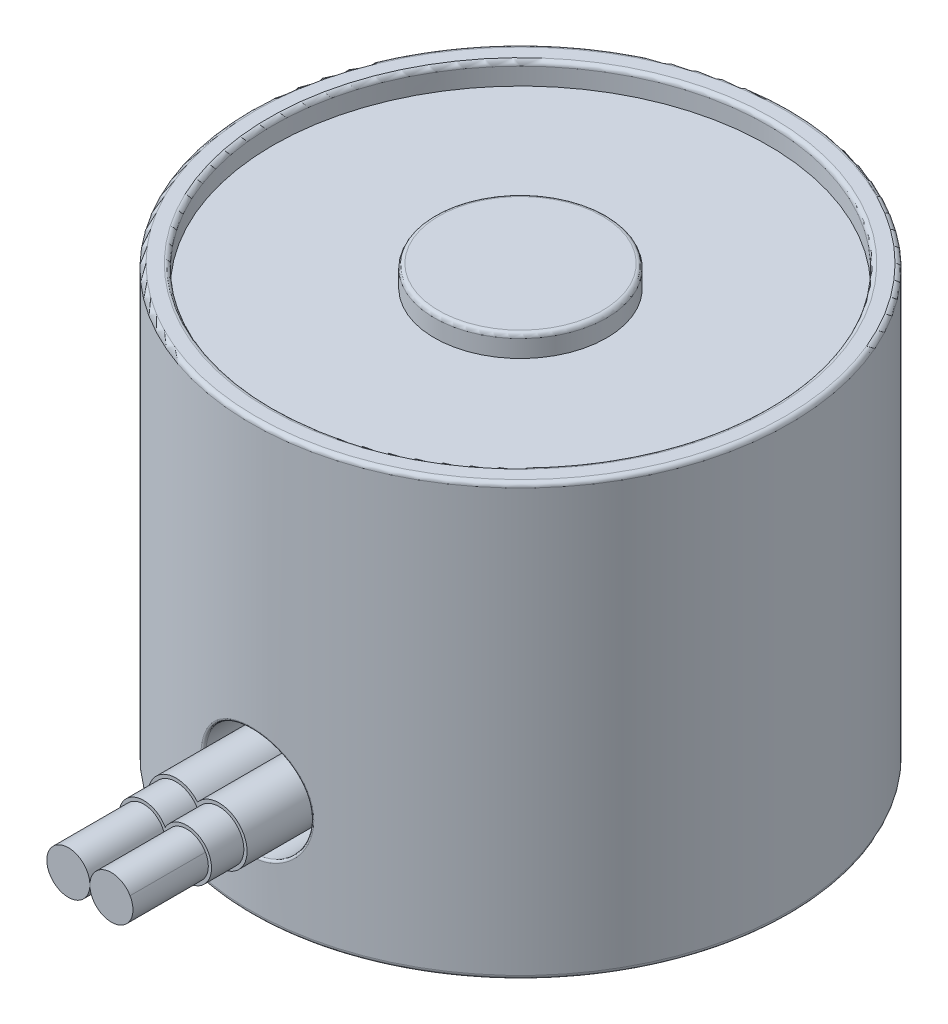
ISO-10303-21;
HEADER;
FILE_DESCRIPTION(('STEP AP214'),'2;1');
FILE_NAME('part.step','',(''),(''),'','','');
FILE_SCHEMA(('AUTOMOTIVE_DESIGN { 1 0 10303 214 1 1 1 1 }'));
ENDSEC;
DATA;
#1=APPLICATION_CONTEXT('core data for automotive mechanical design processes');
#2=APPLICATION_PROTOCOL_DEFINITION('international standard','automotive_design',2000,#1);
#3=PRODUCT_CONTEXT('',#1,'mechanical');
#4=PRODUCT('Part','Part','',(#3));
#5=PRODUCT_RELATED_PRODUCT_CATEGORY('part','',(#4));
#6=PRODUCT_DEFINITION_FORMATION('','',#4);
#7=PRODUCT_DEFINITION_CONTEXT('part definition',#1,'design');
#8=PRODUCT_DEFINITION('design','',#6,#7);
#9=PRODUCT_DEFINITION_SHAPE('','',#8);
#10=(LENGTH_UNIT() NAMED_UNIT(*) SI_UNIT(.MILLI.,.METRE.));
#11=(NAMED_UNIT(*) PLANE_ANGLE_UNIT() SI_UNIT($,.RADIAN.));
#12=(NAMED_UNIT(*) SI_UNIT($,.STERADIAN.) SOLID_ANGLE_UNIT());
#13=UNCERTAINTY_MEASURE_WITH_UNIT(LENGTH_MEASURE(1.E-05),#10,'distance_accuracy_value','');
#14=(GEOMETRIC_REPRESENTATION_CONTEXT(3) GLOBAL_UNCERTAINTY_ASSIGNED_CONTEXT((#13)) GLOBAL_UNIT_ASSIGNED_CONTEXT((#10,
#11,#12)) REPRESENTATION_CONTEXT('',''));
#15=CARTESIAN_POINT('',(0.,0.,0.));
#16=DIRECTION('',(0.,0.,1.));
#17=DIRECTION('',(1.,0.,0.));
#18=AXIS2_PLACEMENT_3D('',#15,#16,#17);
#19=CARTESIAN_POINT('',(0.,19.,0.));
#20=DIRECTION('',(0.,1.,0.));
#21=DIRECTION('',(1.,0.,0.));
#22=AXIS2_PLACEMENT_3D('',#19,#20,#21);
#23=PLANE('',#22);
#24=CARTESIAN_POINT('',(0.,19.,0.));
#25=DIRECTION('',(0.,1.,0.));
#26=DIRECTION('',(-1.,0.,0.));
#27=AXIS2_PLACEMENT_3D('',#24,#25,#26);
#28=CIRCLE('',#27,4.);
#29=CARTESIAN_POINT('',(4.,19.,0.));
#30=VERTEX_POINT('',#29);
#31=EDGE_CURVE('E9',#30,#30,#28,.T.);
#32=ORIENTED_EDGE('',*,*,#31,.F.);
#33=EDGE_LOOP('',(#32));
#34=FACE_BOUND('',#33,.T.);
#35=CARTESIAN_POINT('',(0.,19.,0.));
#36=DIRECTION('',(0.,-1.,0.));
#37=DIRECTION('',(-1.,0.,0.));
#38=AXIS2_PLACEMENT_3D('',#35,#36,#37);
#39=CIRCLE('',#38,11.5);
#40=CARTESIAN_POINT('',(11.5,19.,0.));
#41=VERTEX_POINT('',#40);
#42=EDGE_CURVE('E171',#41,#41,#39,.T.);
#43=ORIENTED_EDGE('',*,*,#42,.F.);
#44=EDGE_LOOP('',(#43));
#45=FACE_BOUND('',#44,.T.);
#46=ADVANCED_FACE('F14',(#34,#45),#23,.T.);
#47=CARTESIAN_POINT('',(0.,20.,0.));
#48=DIRECTION('',(0.,1.,0.));
#49=DIRECTION('',(1.,0.,0.));
#50=AXIS2_PLACEMENT_3D('',#47,#48,#49);
#51=PLANE('',#50);
#52=CARTESIAN_POINT('',(0.,20.,0.));
#53=DIRECTION('',(0.,-1.,0.));
#54=DIRECTION('',(-1.,0.,0.));
#55=AXIS2_PLACEMENT_3D('',#52,#53,#54);
#56=CIRCLE('',#55,3.8);
#57=CARTESIAN_POINT('',(0.,20.,-3.8));
#58=VERTEX_POINT('',#57);
#59=EDGE_CURVE('E173',#58,#58,#56,.T.);
#60=ORIENTED_EDGE('',*,*,#59,.F.);
#61=EDGE_LOOP('',(#60));
#62=FACE_BOUND('',#61,.T.);
#63=ADVANCED_FACE('F650',(#62),#51,.T.);
#64=CARTESIAN_POINT('',(0.,20.,0.));
#65=DIRECTION('',(0.,-1.,0.));
#66=DIRECTION('',(-1.,0.,0.));
#67=AXIS2_PLACEMENT_3D('',#64,#65,#66);
#68=CYLINDRICAL_SURFACE('',#67,4.);
#69=CARTESIAN_POINT('',(0.,19.8,0.));
#70=DIRECTION('',(0.,1.,0.));
#71=DIRECTION('',(-1.,0.,0.));
#72=AXIS2_PLACEMENT_3D('',#69,#70,#71);
#73=CIRCLE('',#72,4.);
#74=CARTESIAN_POINT('',(4.,19.8,0.));
#75=VERTEX_POINT('',#74);
#76=CARTESIAN_POINT('',(0.,19.8,-4.));
#77=VERTEX_POINT('',#76);
#78=EDGE_CURVE('E182',#75,#77,#73,.T.);
#79=ORIENTED_EDGE('',*,*,#78,.F.);
#80=DIRECTION('',(0.,-1.,0.));
#81=VECTOR('',#80,1.);
#82=CARTESIAN_POINT('',(4.,20.,0.));
#83=LINE('',#82,#81);
#84=EDGE_CURVE('E26',#75,#30,#83,.T.);
#85=ORIENTED_EDGE('',*,*,#84,.T.);
#86=ORIENTED_EDGE('',*,*,#31,.T.);
#87=ORIENTED_EDGE('',*,*,#84,.F.);
#88=CARTESIAN_POINT('',(0.,19.8,0.));
#89=DIRECTION('',(0.,1.,0.));
#90=DIRECTION('',(-1.,0.,0.));
#91=AXIS2_PLACEMENT_3D('',#88,#89,#90);
#92=CIRCLE('',#91,4.);
#93=EDGE_CURVE('E178',#77,#75,#92,.T.);
#94=ORIENTED_EDGE('',*,*,#93,.F.);
#95=EDGE_LOOP('',(#79,#85,#86,#87,#94));
#96=FACE_BOUND('',#95,.T.);
#97=ADVANCED_FACE('F596',(#96),#68,.T.);
#98=CARTESIAN_POINT('',(0.,19.8,0.));
#99=DIRECTION('',(0.,1.,0.));
#100=DIRECTION('',(0.,0.,1.));
#101=AXIS2_PLACEMENT_3D('',#98,#99,#100);
#102=TOROIDAL_SURFACE('',#101,3.8,0.2);
#103=ORIENTED_EDGE('',*,*,#59,.T.);
#104=CARTESIAN_POINT('',(0.,19.8,-3.8));
#105=DIRECTION('',(-1.,0.,0.));
#106=DIRECTION('',(0.,0.,-1.));
#107=AXIS2_PLACEMENT_3D('',#104,#105,#106);
#108=CIRCLE('',#107,0.2);
#109=EDGE_CURVE('E177',#58,#77,#108,.T.);
#110=ORIENTED_EDGE('',*,*,#109,.T.);
#111=ORIENTED_EDGE('',*,*,#93,.T.);
#112=ORIENTED_EDGE('',*,*,#78,.T.);
#113=ORIENTED_EDGE('',*,*,#109,.F.);
#114=EDGE_LOOP('',(#103,#110,#111,#112,#113));
#115=FACE_BOUND('',#114,.T.);
#116=ADVANCED_FACE('F472',(#115),#102,.T.);
#117=CARTESIAN_POINT('',(0.,20.,0.));
#118=DIRECTION('',(0.,-1.,0.));
#119=DIRECTION('',(-1.,0.,0.));
#120=AXIS2_PLACEMENT_3D('',#117,#118,#119);
#121=CYLINDRICAL_SURFACE('',#120,11.5);
#122=CARTESIAN_POINT('',(0.,19.8,0.));
#123=DIRECTION('',(0.,-1.,0.));
#124=DIRECTION('',(-1.,0.,0.));
#125=AXIS2_PLACEMENT_3D('',#122,#123,#124);
#126=CIRCLE('',#125,11.5);
#127=CARTESIAN_POINT('',(11.5,19.8,0.));
#128=VERTEX_POINT('',#127);
#129=CARTESIAN_POINT('',(0.,19.8,11.5));
#130=VERTEX_POINT('',#129);
#131=EDGE_CURVE('E172',#128,#130,#126,.T.);
#132=ORIENTED_EDGE('',*,*,#131,.F.);
#133=DIRECTION('',(0.,-1.,0.));
#134=VECTOR('',#133,1.);
#135=CARTESIAN_POINT('',(11.5,20.,0.));
#136=LINE('',#135,#134);
#137=EDGE_CURVE('E167',#128,#41,#136,.T.);
#138=ORIENTED_EDGE('',*,*,#137,.T.);
#139=ORIENTED_EDGE('',*,*,#42,.T.);
#140=ORIENTED_EDGE('',*,*,#137,.F.);
#141=CARTESIAN_POINT('',(0.,19.8,0.));
#142=DIRECTION('',(0.,-1.,0.));
#143=DIRECTION('',(-1.,0.,0.));
#144=AXIS2_PLACEMENT_3D('',#141,#142,#143);
#145=CIRCLE('',#144,11.5);
#146=EDGE_CURVE('E217',#130,#128,#145,.T.);
#147=ORIENTED_EDGE('',*,*,#146,.F.);
#148=EDGE_LOOP('',(#132,#138,#139,#140,#147));
#149=FACE_BOUND('',#148,.T.);
#150=ADVANCED_FACE('F16',(#149),#121,.F.);
#151=CARTESIAN_POINT('',(0.,19.8,0.));
#152=DIRECTION('',(0.,-1.,0.));
#153=DIRECTION('',(0.,0.,-1.));
#154=AXIS2_PLACEMENT_3D('',#151,#152,#153);
#155=TOROIDAL_SURFACE('',#154,11.7,0.2);
#156=CARTESIAN_POINT('',(0.,20.,0.));
#157=DIRECTION('',(0.,1.,0.));
#158=DIRECTION('',(-1.,0.,0.));
#159=AXIS2_PLACEMENT_3D('',#156,#157,#158);
#160=CIRCLE('',#159,11.7);
#161=CARTESIAN_POINT('',(0.,20.,11.7));
#162=VERTEX_POINT('',#161);
#163=EDGE_CURVE('E211',#162,#162,#160,.T.);
#164=ORIENTED_EDGE('',*,*,#163,.T.);
#165=CARTESIAN_POINT('',(0.,19.8,11.7));
#166=DIRECTION('',(-1.,0.,0.));
#167=DIRECTION('',(0.,0.,1.));
#168=AXIS2_PLACEMENT_3D('',#165,#166,#167);
#169=CIRCLE('',#168,0.2);
#170=EDGE_CURVE('E215',#162,#130,#169,.T.);
#171=ORIENTED_EDGE('',*,*,#170,.T.);
#172=ORIENTED_EDGE('',*,*,#146,.T.);
#173=ORIENTED_EDGE('',*,*,#131,.T.);
#174=ORIENTED_EDGE('',*,*,#170,.F.);
#175=EDGE_LOOP('',(#164,#171,#172,#173,#174));
#176=FACE_BOUND('',#175,.T.);
#177=ADVANCED_FACE('F471',(#176),#155,.T.);
#178=CARTESIAN_POINT('',(0.,20.,0.));
#179=DIRECTION('',(0.,1.,0.));
#180=DIRECTION('',(1.,0.,0.));
#181=AXIS2_PLACEMENT_3D('',#178,#179,#180);
#182=PLANE('',#181);
#183=ORIENTED_EDGE('',*,*,#163,.F.);
#184=EDGE_LOOP('',(#183));
#185=FACE_BOUND('',#184,.T.);
#186=CARTESIAN_POINT('',(0.,20.,0.));
#187=DIRECTION('',(0.,-1.,0.));
#188=DIRECTION('',(1.,0.,0.));
#189=AXIS2_PLACEMENT_3D('',#186,#187,#188);
#190=CIRCLE('',#189,12.3);
#191=CARTESIAN_POINT('',(0.,20.,-12.3));
#192=VERTEX_POINT('',#191);
#193=EDGE_CURVE('E251',#192,#192,#190,.T.);
#194=ORIENTED_EDGE('',*,*,#193,.F.);
#195=EDGE_LOOP('',(#194));
#196=FACE_BOUND('',#195,.T.);
#197=ADVANCED_FACE('F334',(#185,#196),#182,.T.);
#198=CARTESIAN_POINT('',(0.,19.8,0.));
#199=DIRECTION('',(0.,1.,0.));
#200=DIRECTION('',(0.,0.,1.));
#201=AXIS2_PLACEMENT_3D('',#198,#199,#200);
#202=TOROIDAL_SURFACE('',#201,12.3,0.2);
#203=ORIENTED_EDGE('',*,*,#193,.T.);
#204=CARTESIAN_POINT('',(0.,19.8,-12.3));
#205=DIRECTION('',(-1.,0.,0.));
#206=DIRECTION('',(0.,0.,-1.));
#207=AXIS2_PLACEMENT_3D('',#204,#205,#206);
#208=CIRCLE('',#207,0.2);
#209=CARTESIAN_POINT('',(0.,19.8,-12.5));
#210=VERTEX_POINT('',#209);
#211=EDGE_CURVE('E216',#192,#210,#208,.T.);
#212=ORIENTED_EDGE('',*,*,#211,.T.);
#213=CARTESIAN_POINT('',(0.,19.8,0.));
#214=DIRECTION('',(0.,1.,0.));
#215=DIRECTION('',(1.,0.,0.));
#216=AXIS2_PLACEMENT_3D('',#213,#214,#215);
#217=CIRCLE('',#216,12.5);
#218=CARTESIAN_POINT('',(-12.5,19.8,0.));
#219=VERTEX_POINT('',#218);
#220=EDGE_CURVE('E185',#210,#219,#217,.T.);
#221=ORIENTED_EDGE('',*,*,#220,.T.);
#222=CARTESIAN_POINT('',(0.,19.8,0.));
#223=DIRECTION('',(0.,1.,0.));
#224=DIRECTION('',(1.,0.,0.));
#225=AXIS2_PLACEMENT_3D('',#222,#223,#224);
#226=CIRCLE('',#225,12.5);
#227=EDGE_CURVE('E281',#219,#210,#226,.T.);
#228=ORIENTED_EDGE('',*,*,#227,.T.);
#229=ORIENTED_EDGE('',*,*,#211,.F.);
#230=EDGE_LOOP('',(#203,#212,#221,#228,#229));
#231=FACE_BOUND('',#230,.T.);
#232=ADVANCED_FACE('F332',(#231),#202,.T.);
#233=CARTESIAN_POINT('',(0.,0.,0.));
#234=DIRECTION('',(0.,1.,0.));
#235=DIRECTION('',(1.,0.,0.));
#236=AXIS2_PLACEMENT_3D('',#233,#234,#235);
#237=PLANE('',#236);
#238=CARTESIAN_POINT('',(0.,0.,0.));
#239=DIRECTION('',(0.,1.,0.));
#240=DIRECTION('',(1.,0.,0.));
#241=AXIS2_PLACEMENT_3D('',#238,#239,#240);
#242=CIRCLE('',#241,12.3);
#243=CARTESIAN_POINT('',(0.,0.,-12.3));
#244=VERTEX_POINT('',#243);
#245=EDGE_CURVE('E64',#244,#244,#242,.T.);
#246=ORIENTED_EDGE('',*,*,#245,.F.);
#247=EDGE_LOOP('',(#246));
#248=FACE_BOUND('',#247,.T.);
#249=ADVANCED_FACE('F500',(#248),#237,.F.);
#250=CARTESIAN_POINT('',(0.,0.2,0.));
#251=DIRECTION('',(0.,1.,0.));
#252=DIRECTION('',(0.,0.,1.));
#253=AXIS2_PLACEMENT_3D('',#250,#251,#252);
#254=TOROIDAL_SURFACE('',#253,12.3,0.2);
#255=CARTESIAN_POINT('',(0.,0.2,0.));
#256=DIRECTION('',(0.,-1.,0.));
#257=DIRECTION('',(1.,0.,0.));
#258=AXIS2_PLACEMENT_3D('',#255,#256,#257);
#259=CIRCLE('',#258,12.5);
#260=CARTESIAN_POINT('',(-12.5,0.2,0.));
#261=VERTEX_POINT('',#260);
#262=CARTESIAN_POINT('',(0.,0.2,-12.5));
#263=VERTEX_POINT('',#262);
#264=EDGE_CURVE('E194',#261,#263,#259,.T.);
#265=ORIENTED_EDGE('',*,*,#264,.T.);
#266=CARTESIAN_POINT('',(0.,0.2,-12.3));
#267=DIRECTION('',(-1.,0.,0.));
#268=DIRECTION('',(0.,0.,-1.));
#269=AXIS2_PLACEMENT_3D('',#266,#267,#268);
#270=CIRCLE('',#269,0.2);
#271=EDGE_CURVE('E76',#263,#244,#270,.T.);
#272=ORIENTED_EDGE('',*,*,#271,.T.);
#273=ORIENTED_EDGE('',*,*,#245,.T.);
#274=ORIENTED_EDGE('',*,*,#271,.F.);
#275=CARTESIAN_POINT('',(0.,0.2,0.));
#276=DIRECTION('',(0.,-1.,0.));
#277=DIRECTION('',(1.,0.,0.));
#278=AXIS2_PLACEMENT_3D('',#275,#276,#277);
#279=CIRCLE('',#278,12.5);
#280=EDGE_CURVE('E191',#263,#261,#279,.T.);
#281=ORIENTED_EDGE('',*,*,#280,.T.);
#282=EDGE_LOOP('',(#265,#272,#273,#274,#281));
#283=FACE_BOUND('',#282,.T.);
#284=ADVANCED_FACE('F508',(#283),#254,.T.);
#285=CARTESIAN_POINT('',(0.,5.,0.));
#286=DIRECTION('',(0.,0.,1.));
#287=DIRECTION('',(1.,0.,0.));
#288=AXIS2_PLACEMENT_3D('',#285,#286,#287);
#289=PLANE('',#288);
#290=CARTESIAN_POINT('',(1.,5.,0.));
#291=DIRECTION('',(0.,0.,-1.));
#292=DIRECTION('',(-0.769230769230768,-0.638971066378315,0.));
#293=AXIS2_PLACEMENT_3D('',#290,#291,#292);
#294=CIRCLE('',#293,1.3);
#295=CARTESIAN_POINT('',(0.,5.83066238629182,0.));
#296=VERTEX_POINT('',#295);
#297=CARTESIAN_POINT('',(0.,4.16933761370818,0.));
#298=VERTEX_POINT('',#297);
#299=EDGE_CURVE('E227',#296,#298,#294,.T.);
#300=ORIENTED_EDGE('',*,*,#299,.T.);
#301=CARTESIAN_POINT('',(-1.,5.,0.));
#302=DIRECTION('',(0.,0.,-1.));
#303=DIRECTION('',(0.769230769230762,0.638971066378322,0.));
#304=AXIS2_PLACEMENT_3D('',#301,#302,#303);
#305=CIRCLE('',#304,1.3);
#306=EDGE_CURVE('E234',#298,#296,#305,.T.);
#307=ORIENTED_EDGE('',*,*,#306,.T.);
#308=EDGE_LOOP('',(#300,#307));
#309=FACE_BOUND('',#308,.T.);
#310=CARTESIAN_POINT('',(0.,5.,0.));
#311=DIRECTION('',(0.,0.,1.));
#312=DIRECTION('',(1.,0.,0.));
#313=AXIS2_PLACEMENT_3D('',#310,#311,#312);
#314=CIRCLE('',#313,2.5);
#315=CARTESIAN_POINT('',(-2.5,5.,0.));
#316=VERTEX_POINT('',#315);
#317=EDGE_CURVE('E228',#316,#316,#314,.T.);
#318=ORIENTED_EDGE('',*,*,#317,.T.);
#319=EDGE_LOOP('',(#318));
#320=FACE_BOUND('',#319,.T.);
#321=ADVANCED_FACE('F517',(#309,#320),#289,.T.);
#322=CARTESIAN_POINT('',(0.,0.,0.));
#323=DIRECTION('',(0.,1.,0.));
#324=DIRECTION('',(1.,0.,0.));
#325=AXIS2_PLACEMENT_3D('',#322,#323,#324);
#326=CYLINDRICAL_SURFACE('',#325,12.5);
#327=CARTESIAN_POINT('',(2.62096774193548,5.,12.2221327146997));
#328=CARTESIAN_POINT('',(2.62096774193548,5.39003911135222,12.2221327146997));
#329=CARTESIAN_POINT('',(2.44004653807788,6.16909968875933,12.2630524567356));
#330=CARTESIAN_POINT('',(1.69122556593684,7.10077797194836,12.3973092194891));
#331=CARTESIAN_POINT('',(0.60534017111768,7.62125366534422,12.5041549501595));
#332=CARTESIAN_POINT('',(-0.403066246029504,7.6209294634289,12.5040898123383));
#333=CARTESIAN_POINT('',(-1.52250596083931,7.23269233257117,12.4247715667749));
#334=CARTESIAN_POINT('',(-2.39671817334408,6.36626490437071,12.2732723181436));
#335=CARTESIAN_POINT('',(-2.71119277914847,4.99948907747914,12.2017167830903));
#336=CARTESIAN_POINT('',(-2.50041580249885,4.09125680399768,12.2490877657974));
#337=CARTESIAN_POINT('',(-1.9128144644601,3.07752001464117,12.3599229033962));
#338=CARTESIAN_POINT('',(-0.877887559476048,2.37628807935753,12.5055701838177));
#339=CARTESIAN_POINT('',(0.606618381677696,2.3795984928457,12.503678010273));
#340=CARTESIAN_POINT('',(1.50852248568652,2.81286734593311,12.4158052662696));
#341=CARTESIAN_POINT('',(2.34484507082126,3.64010689441454,12.2866738341227));
#342=CARTESIAN_POINT('',(2.62096774193548,4.41494133297166,12.2221327146997));
#343=CARTESIAN_POINT('',(2.62096774193548,5.,12.2221327146997));
#344=(BOUNDED_CURVE() B_SPLINE_CURVE(3,(#327,#328,#329,#330,#331,#332,#333,#334,#335,#336,#337,
#338,#339,#340,#341,#342,#343),.UNSPECIFIED.,.T.,.F.) B_SPLINE_CURVE_WITH_KNOTS((4,1,1,1,1,1,1,
1,1,1,1,1,1,1,4),(0.,0.10793847745063,0.21587695490126,0.32381543235189,0.43175390980251,
0.48572314852783,0.647630864703769,0.755569342154397,0.863507819605025,0.899487312088567,
1.07938477450628,1.18732325195691,1.29526172940754,1.34923096813285,1.51113868430879),
.UNSPECIFIED.) CURVE() GEOMETRIC_REPRESENTATION_ITEM() RATIONAL_B_SPLINE_CURVE((1.,1.,1.,1.,1.,
1.,1.,1.,1.,1.,1.,1.,1.,1.,1.,1.,1.)) REPRESENTATION_ITEM(''));
#345=CARTESIAN_POINT('',(2.62096774193548,5.,12.2221327146997));
#346=VERTEX_POINT('',#345);
#347=EDGE_CURVE('E233',#346,#346,#344,.T.);
#348=ORIENTED_EDGE('',*,*,#347,.F.);
#349=EDGE_LOOP('',(#348));
#350=FACE_BOUND('',#349,.T.);
#351=ORIENTED_EDGE('',*,*,#227,.F.);
#352=DIRECTION('',(0.,-1.,0.));
#353=VECTOR('',#352,1.);
#354=CARTESIAN_POINT('',(-12.5,0.,0.));
#355=LINE('',#354,#353);
#356=EDGE_CURVE('E195',#219,#261,#355,.T.);
#357=ORIENTED_EDGE('',*,*,#356,.T.);
#358=ORIENTED_EDGE('',*,*,#280,.F.);
#359=ORIENTED_EDGE('',*,*,#264,.F.);
#360=ORIENTED_EDGE('',*,*,#356,.F.);
#361=ORIENTED_EDGE('',*,*,#220,.F.);
#362=EDGE_LOOP('',(#351,#357,#358,#359,#360,#361));
#363=FACE_BOUND('',#362,.T.);
#364=ADVANCED_FACE('F513',(#350,#363),#326,.T.);
#365=CARTESIAN_POINT('',(0.,5.,0.));
#366=DIRECTION('',(0.,0.,1.));
#367=DIRECTION('',(1.,0.,0.));
#368=AXIS2_PLACEMENT_3D('',#365,#366,#367);
#369=CYLINDRICAL_SURFACE('',#368,2.5);
#370=ORIENTED_EDGE('',*,*,#317,.F.);
#371=DIRECTION('',(0.,0.,1.));
#372=VECTOR('',#371,1.);
#373=CARTESIAN_POINT('',(-2.5,5.,0.));
#374=LINE('',#373,#372);
#375=CARTESIAN_POINT('',(-2.50012742967431,5.00011238977006,12.1243132069834));
#376=VERTEX_POINT('',#375);
#377=EDGE_CURVE('E232',#316,#376,#374,.T.);
#378=ORIENTED_EDGE('',*,*,#377,.T.);
#379=CARTESIAN_POINT('',(2.5,5.,12.1243556529821));
#380=CARTESIAN_POINT('',(2.5,4.43744358939583,12.1243556529821));
#381=CARTESIAN_POINT('',(2.23662145216797,3.6924104753986,12.1883804434497));
#382=CARTESIAN_POINT('',(1.43889837096253,2.89698783262799,12.3164788241395));
#383=CARTESIAN_POINT('',(0.578620610215648,2.48038316619779,12.4036485861908));
#384=CARTESIAN_POINT('',(-0.837369672115614,2.47720007630532,12.4055256223472));
#385=CARTESIAN_POINT('',(-1.82453071994656,3.15146155253958,12.261043520169));
#386=CARTESIAN_POINT('',(-2.38501199622967,4.12620846538239,12.151095063671));
#387=CARTESIAN_POINT('',(-2.58606080472623,4.99950872834533,12.1041030488256));
#388=CARTESIAN_POINT('',(-2.28610041149743,6.3137162542026,12.1750861395985));
#389=CARTESIAN_POINT('',(-1.45223645495442,7.1468195505492,12.3253733942407));
#390=CARTESIAN_POINT('',(-0.38446318852045,7.52012448406625,12.4040570938396));
#391=CARTESIAN_POINT('',(0.577401393989172,7.52043621667713,12.4041217105582));
#392=CARTESIAN_POINT('',(1.61316900135514,7.01997881918111,12.2981307457331));
#393=CARTESIAN_POINT('',(2.32742900555121,6.12413431611474,12.1649480370817));
#394=CARTESIAN_POINT('',(2.5,5.37503760706945,12.1243556529821));
#395=CARTESIAN_POINT('',(2.5,5.,12.1243556529821));
#396=(BOUNDED_CURVE() B_SPLINE_CURVE(3,(#379,#380,#381,#382,#383,#384,#385,#386,#387,#388,#389,
#390,#391,#392,#393,#394,#395),.UNSPECIFIED.,.T.,.F.) B_SPLINE_CURVE_WITH_KNOTS((4,1,1,1,1,1,1,
1,1,1,1,1,1,1,4),(0.,0.161907716175941,0.215876954901255,0.323815432351883,0.43175390980251,
0.611651372220223,0.647630864703765,0.755569342154393,0.863507819605021,1.02541553578096,
1.07938477450628,1.1873232519569,1.29526172940753,1.40320020685816,1.51113868430879),
.UNSPECIFIED.) CURVE() GEOMETRIC_REPRESENTATION_ITEM() RATIONAL_B_SPLINE_CURVE((1.,1.,1.,1.,1.,
1.,1.,1.,1.,1.,1.,1.,1.,1.,1.,1.,1.)) REPRESENTATION_ITEM(''));
#397=CARTESIAN_POINT('',(2.5,5.,12.1243556529821));
#398=VERTEX_POINT('',#397);
#399=EDGE_CURVE('E371',#398,#376,#396,.T.);
#400=ORIENTED_EDGE('',*,*,#399,.F.);
#401=CARTESIAN_POINT('',(2.5,5.,12.1243556529821));
#402=CARTESIAN_POINT('',(2.5,4.43744358939583,12.1243556529821));
#403=CARTESIAN_POINT('',(2.23662145216797,3.6924104753986,12.1883804434497));
#404=CARTESIAN_POINT('',(1.43889837096253,2.89698783262799,12.3164788241395));
#405=CARTESIAN_POINT('',(0.578620610215648,2.48038316619779,12.4036485861908));
#406=CARTESIAN_POINT('',(-0.837369672115614,2.47720007630532,12.4055256223472));
#407=CARTESIAN_POINT('',(-1.82453071994656,3.15146155253958,12.261043520169));
#408=CARTESIAN_POINT('',(-2.38501199622967,4.12620846538239,12.151095063671));
#409=CARTESIAN_POINT('',(-2.58606080472623,4.99950872834533,12.1041030488256));
#410=CARTESIAN_POINT('',(-2.28610041149743,6.3137162542026,12.1750861395985));
#411=CARTESIAN_POINT('',(-1.45223645495442,7.1468195505492,12.3253733942407));
#412=CARTESIAN_POINT('',(-0.38446318852045,7.52012448406625,12.4040570938396));
#413=CARTESIAN_POINT('',(0.577401393989172,7.52043621667713,12.4041217105582));
#414=CARTESIAN_POINT('',(1.61316900135514,7.01997881918111,12.2981307457331));
#415=CARTESIAN_POINT('',(2.32742900555121,6.12413431611474,12.1649480370817));
#416=CARTESIAN_POINT('',(2.5,5.37503760706945,12.1243556529821));
#417=CARTESIAN_POINT('',(2.5,5.,12.1243556529821));
#418=(BOUNDED_CURVE() B_SPLINE_CURVE(3,(#401,#402,#403,#404,#405,#406,#407,#408,#409,#410,#411,
#412,#413,#414,#415,#416,#417),.UNSPECIFIED.,.T.,.F.) B_SPLINE_CURVE_WITH_KNOTS((4,1,1,1,1,1,1,
1,1,1,1,1,1,1,4),(0.,0.161907716175941,0.215876954901255,0.323815432351883,0.43175390980251,
0.611651372220223,0.647630864703765,0.755569342154393,0.863507819605021,1.02541553578096,
1.07938477450628,1.1873232519569,1.29526172940753,1.40320020685816,1.51113868430879),
.UNSPECIFIED.) CURVE() GEOMETRIC_REPRESENTATION_ITEM() RATIONAL_B_SPLINE_CURVE((1.,1.,1.,1.,1.,
1.,1.,1.,1.,1.,1.,1.,1.,1.,1.,1.,1.)) REPRESENTATION_ITEM(''));
#419=EDGE_CURVE('E368',#376,#398,#418,.T.);
#420=ORIENTED_EDGE('',*,*,#419,.F.);
#421=ORIENTED_EDGE('',*,*,#377,.F.);
#422=EDGE_LOOP('',(#370,#378,#400,#420,#421));
#423=FACE_BOUND('',#422,.T.);
#424=ADVANCED_FACE('F331',(#423),#369,.F.);
#425=CARTESIAN_POINT('',(2.5,5.,12.1243556529821));
#426=CARTESIAN_POINT('',(2.5,4.43744358939583,12.1243556529821));
#427=CARTESIAN_POINT('',(2.23662145216797,3.6924104753986,12.1883804434497));
#428=CARTESIAN_POINT('',(1.43889837096253,2.89698783262799,12.3164788241395));
#429=CARTESIAN_POINT('',(0.578620610215648,2.48038316619779,12.4036485861908));
#430=CARTESIAN_POINT('',(-0.837369672115614,2.47720007630532,12.4055256223472));
#431=CARTESIAN_POINT('',(-1.82453071994656,3.15146155253958,12.261043520169));
#432=CARTESIAN_POINT('',(-2.38501199622967,4.12620846538239,12.151095063671));
#433=CARTESIAN_POINT('',(-2.58606080472623,4.99950872834533,12.1041030488256));
#434=CARTESIAN_POINT('',(-2.28610041149743,6.3137162542026,12.1750861395985));
#435=CARTESIAN_POINT('',(-1.45223645495442,7.1468195505492,12.3253733942407));
#436=CARTESIAN_POINT('',(-0.38446318852045,7.52012448406625,12.4040570938396));
#437=CARTESIAN_POINT('',(0.577401393989172,7.52043621667713,12.4041217105582));
#438=CARTESIAN_POINT('',(1.61316900135514,7.01997881918111,12.2981307457331));
#439=CARTESIAN_POINT('',(2.32742900555121,6.12413431611474,12.1649480370817));
#440=CARTESIAN_POINT('',(2.5,5.37503760706945,12.1243556529821));
#441=CARTESIAN_POINT('',(2.5,5.,12.1243556529821));
#442=CARTESIAN_POINT('',(2.5,5.,12.1413274754625));
#443=CARTESIAN_POINT('',(2.5,4.43826859033432,12.1413274754625));
#444=CARTESIAN_POINT('',(2.23752715448541,3.69404126048831,12.2047888444426));
#445=CARTESIAN_POINT('',(1.44031042818264,2.89789033721874,12.3319583826836));
#446=CARTESIAN_POINT('',(0.579476634810708,2.48034758114559,12.4185863318672));
#447=CARTESIAN_POINT('',(-0.838643678822729,2.47715637288066,12.420439763317));
#448=CARTESIAN_POINT('',(-1.82595395329574,3.15294892406207,12.2768942221525));
#449=CARTESIAN_POINT('',(-2.38537241199443,4.12744548006008,12.1678306312553));
#450=CARTESIAN_POINT('',(-2.58575368385976,4.99950691272241,12.1212595142211));
#451=CARTESIAN_POINT('',(-2.28687268639111,6.31182176974931,12.1915946331315));
#452=CARTESIAN_POINT('',(-1.45381291201748,7.14597663755951,12.3407881807139));
#453=CARTESIAN_POINT('',(-0.384980090516126,7.52016669466172,12.4189938578584));
#454=CARTESIAN_POINT('',(0.57821496252381,7.52047312786497,12.4190520191013));
#455=CARTESIAN_POINT('',(1.61473767550994,7.01884546539879,12.313724751529));
#456=CARTESIAN_POINT('',(2.32802065868572,6.12255469413481,12.1815523975288));
#457=CARTESIAN_POINT('',(2.5,5.37448760644379,12.1413274754625));
#458=CARTESIAN_POINT('',(2.5,5.,12.1413274754625));
#459=CARTESIAN_POINT('',(2.50883963232213,5.,12.1751835272115));
#460=CARTESIAN_POINT('',(2.50883963232213,4.43791165211751,12.1751835272115));
#461=CARTESIAN_POINT('',(2.24670878820688,3.69279822013093,12.2375297284407));
#462=CARTESIAN_POINT('',(1.44733269309373,2.89339677878739,12.3628560021269));
#463=CARTESIAN_POINT('',(0.582681268216739,2.47339946897422,12.4484099371712));
#464=CARTESIAN_POINT('',(-0.843332898530295,2.47017740370695,12.4502156462797));
#465=CARTESIAN_POINT('',(-1.83437338524155,3.14999298431348,12.308528564598));
#466=CARTESIAN_POINT('',(-2.39432719452025,4.12683692551064,12.2012207302856));
#467=CARTESIAN_POINT('',(-2.59448136575975,4.99949901644673,12.1554840981831));
#468=CARTESIAN_POINT('',(-2.29605313562351,6.31270405198995,12.2245341455042));
#469=CARTESIAN_POINT('',(-1.46110827813072,7.15067374961533,12.3715582806025));
#470=CARTESIAN_POINT('',(-0.387038663527688,7.52712862672486,12.4488147329756));
#471=CARTESIAN_POINT('',(0.581355908853462,7.52742868813613,12.448860896441));
#472=CARTESIAN_POINT('',(1.62259905890577,7.02278372051319,12.3448494446243));
#473=CARTESIAN_POINT('',(2.33708471242176,6.1233635855319,12.2146808236779));
#474=CARTESIAN_POINT('',(2.50883963232213,5.37472556525499,12.1751835272115));
#475=CARTESIAN_POINT('',(2.50883963232213,5.,12.1751835272115));
#476=CARTESIAN_POINT('',(2.55125874647239,5.,12.2196439080646));
#477=CARTESIAN_POINT('',(2.55125874647239,4.43050755870945,12.2196439080646));
#478=CARTESIAN_POINT('',(2.28465672640583,3.67553308930592,12.2813214497925));
#479=CARTESIAN_POINT('',(1.47169922205855,2.86535576618458,12.4055527326647));
#480=CARTESIAN_POINT('',(0.592453432898863,2.43967967036256,12.4904570561058));
#481=CARTESIAN_POINT('',(-0.857472844911407,2.4364052841377,12.4922393834871));
#482=CARTESIAN_POINT('',(-1.86530252742733,3.12544402274239,12.351664312814));
#483=CARTESIAN_POINT('',(-2.43479944775193,4.11533445589087,12.2453939789031));
#484=CARTESIAN_POINT('',(-2.63835991471072,4.99948827356365,12.2001502848133));
#485=CARTESIAN_POINT('',(-2.33484902039923,6.33000784057218,12.268443661442));
#486=CARTESIAN_POINT('',(-1.48569208358341,7.17930953362674,12.4141744010918));
#487=CARTESIAN_POINT('',(-0.393532410986059,7.56085664543512,12.4908640125671));
#488=CARTESIAN_POINT('',(0.591108783435625,7.56116322295516,12.4908993068028));
#489=CARTESIAN_POINT('',(1.64992391016497,7.04968316127368,12.387682528405));
#490=CARTESIAN_POINT('',(2.37658109769763,6.13817276665352,12.2587072747931));
#491=CARTESIAN_POINT('',(2.55125874647239,5.37966162752703,12.2196439080646));
#492=CARTESIAN_POINT('',(2.55125874647239,5.,12.2196439080646));
#493=CARTESIAN_POINT('',(2.59607591792367,5.,12.2274706266089));
#494=CARTESIAN_POINT('',(2.59607591792367,4.42081247794265,12.2274706266089));
#495=CARTESIAN_POINT('',(2.32331946541377,3.65344513037572,12.290608328375));
#496=CARTESIAN_POINT('',(1.49531645067799,2.83261281023527,12.417243561848));
#497=CARTESIAN_POINT('',(0.601521972697014,2.40218288268059,12.5035961625493));
#498=CARTESIAN_POINT('',(-0.870539729566443,2.3988889716227,12.5054249178883));
#499=CARTESIAN_POINT('',(-1.89579449532183,3.09555831075451,12.3623862377586));
#500=CARTESIAN_POINT('',(-2.47696948328702,4.10032770754088,12.2538525103557));
#501=CARTESIAN_POINT('',(-2.68519054422168,4.99948920160216,12.2075366768134));
#502=CARTESIAN_POINT('',(-2.37459760968447,6.35260019505303,12.277472771432));
#503=CARTESIAN_POINT('',(-1.50929444617209,7.21261449665922,12.4260450320866));
#504=CARTESIAN_POINT('',(-0.399637802393393,7.59834449835438,12.5039965334129));
#505=CARTESIAN_POINT('',(0.600222051576277,7.59866604835004,12.5040565957256));
#506=CARTESIAN_POINT('',(1.67641498396671,7.08155197635833,12.3990705210396));
#507=CARTESIAN_POINT('',(2.41736459653086,6.15744884075939,12.2674796754914));
#508=CARTESIAN_POINT('',(2.59607591792367,5.3861250147049,12.2274706266089));
#509=CARTESIAN_POINT('',(2.59607591792367,5.,12.2274706266089));
#510=CARTESIAN_POINT('',(2.62096774193548,5.,12.2221327146997));
#511=CARTESIAN_POINT('',(2.62096774193548,4.41494133297166,12.2221327146997));
#512=CARTESIAN_POINT('',(2.34484507082126,3.64010689441454,12.2866738341227));
#513=CARTESIAN_POINT('',(1.50852248568652,2.81286734593311,12.4158052662696));
#514=CARTESIAN_POINT('',(0.606618381677696,2.3795984928457,12.503678010273));
#515=CARTESIAN_POINT('',(-0.877887559476048,2.37628807935753,12.5055701838177));
#516=CARTESIAN_POINT('',(-1.9128144644601,3.07752001464117,12.3599229033962));
#517=CARTESIAN_POINT('',(-2.50041580249885,4.09125680399768,12.2490877657974));
#518=CARTESIAN_POINT('',(-2.71119277914847,4.99948907747914,12.2017167830903));
#519=CARTESIAN_POINT('',(-2.39671817334408,6.36626490437071,12.2732723181436));
#520=CARTESIAN_POINT('',(-1.52250596083931,7.23269233257117,12.4247715667749));
#521=CARTESIAN_POINT('',(-0.403066246029504,7.6209294634289,12.5040898123383));
#522=CARTESIAN_POINT('',(0.60534017111768,7.62125366534422,12.5041549501595));
#523=CARTESIAN_POINT('',(1.69122556593684,7.10077797194836,12.3973092194891));
#524=CARTESIAN_POINT('',(2.44004653807788,6.16909968875933,12.2630524567356));
#525=CARTESIAN_POINT('',(2.62096774193548,5.39003911135222,12.2221327146997));
#526=CARTESIAN_POINT('',(2.62096774193548,5.,12.2221327146997));
#527=(BOUNDED_SURFACE() B_SPLINE_SURFACE(3,3,((#425,#426,#427,#428,#429,#430,#431,#432,#433,
#434,#435,#436,#437,#438,#439,#440,#441),(#442,#443,#444,#445,#446,#447,#448,#449,#450,#451,
#452,#453,#454,#455,#456,#457,#458),(#459,#460,#461,#462,#463,#464,#465,#466,#467,#468,#469,
#470,#471,#472,#473,#474,#475),(#476,#477,#478,#479,#480,#481,#482,#483,#484,#485,#486,#487,
#488,#489,#490,#491,#492),(#493,#494,#495,#496,#497,#498,#499,#500,#501,#502,#503,#504,#505,
#506,#507,#508,#509),(#510,#511,#512,#513,#514,#515,#516,#517,#518,#519,#520,#521,#522,#523,
#524,#525,#526)),.UNSPECIFIED.,.F.,.T.,.F.) B_SPLINE_SURFACE_WITH_KNOTS((4,1,1,4),(4,1,1,1,1,1,
1,1,1,1,1,1,1,1,4),(0.,0.285714285714286,0.571428571428571,1.),(0.,0.161907716175941,
0.215876954901255,0.323815432351883,0.43175390980251,0.611651372220223,0.647630864703765,
0.755569342154393,0.863507819605021,1.02541553578096,1.07938477450628,1.1873232519569,
1.29526172940753,1.40320020685816,1.51113868430879),
.UNSPECIFIED.) GEOMETRIC_REPRESENTATION_ITEM() RATIONAL_B_SPLINE_SURFACE(((1.,1.,1.,1.,1.,1.,1.,
1.,1.,1.,1.,1.,1.,1.,1.,1.,1.),(1.,1.,1.,1.,1.,1.,1.,1.,1.,1.,1.,1.,1.,1.,1.,1.,1.),(1.,1.,1.,
1.,1.,1.,1.,1.,1.,1.,1.,1.,1.,1.,1.,1.,1.),(1.,1.,1.,1.,1.,1.,1.,1.,1.,1.,1.,1.,1.,1.,1.,1.,1.),
(1.,1.,1.,1.,1.,1.,1.,1.,1.,1.,1.,1.,1.,1.,1.,1.,1.),(1.,1.,1.,1.,1.,1.,1.,1.,1.,1.,1.,1.,1.,1.,
1.,1.,1.))) REPRESENTATION_ITEM('') SURFACE());
#528=CARTESIAN_POINT('',(2.62096774193548,4.99999999999982,12.2221327146997));
#529=CARTESIAN_POINT('',(2.59607591792367,4.99999999999982,12.2274706266089));
#530=CARTESIAN_POINT('',(2.55125874647239,4.99999999999982,12.2196439080646));
#531=CARTESIAN_POINT('',(2.50883963232213,4.99999999999982,12.1751835272115));
#532=CARTESIAN_POINT('',(2.5,4.99999999999982,12.1413274754625));
#533=CARTESIAN_POINT('',(2.5,4.99999999999982,12.1243556529821));
#534=(BOUNDED_CURVE() B_SPLINE_CURVE(3,(#528,#529,#530,#531,#532,#533),.UNSPECIFIED.,.F.,
.F.) B_SPLINE_CURVE_WITH_KNOTS((4,1,1,4),(0.,0.428571428571429,0.714285714285714,1.),
.UNSPECIFIED.) CURVE() GEOMETRIC_REPRESENTATION_ITEM() RATIONAL_B_SPLINE_CURVE((1.,1.,1.,1.,1.,1.)) REPRESENTATION_ITEM(''));
#535=EDGE_CURVE('E264',#346,#398,#534,.T.);
#536=ORIENTED_EDGE('',*,*,#535,.T.);
#537=ORIENTED_EDGE('',*,*,#399,.T.);
#538=ORIENTED_EDGE('',*,*,#419,.T.);
#539=ORIENTED_EDGE('',*,*,#535,.F.);
#540=ORIENTED_EDGE('',*,*,#347,.T.);
#541=EDGE_LOOP('',(#536,#537,#538,#539,#540));
#542=FACE_BOUND('',#541,.T.);
#543=ADVANCED_FACE('F318',(#542),#527,.F.);
#544=CARTESIAN_POINT('',(0.,5.,15.));
#545=DIRECTION('',(0.,0.,1.));
#546=DIRECTION('',(1.,0.,0.));
#547=AXIS2_PLACEMENT_3D('',#544,#545,#546);
#548=PLANE('',#547);
#549=CARTESIAN_POINT('',(1.,5.,15.));
#550=DIRECTION('',(0.,0.,-1.));
#551=DIRECTION('',(-0.8695652173913,-0.493818117026119,0.));
#552=AXIS2_PLACEMENT_3D('',#549,#550,#551);
#553=CIRCLE('',#552,1.15);
#554=CARTESIAN_POINT('',(0.,5.56789083458004,15.));
#555=VERTEX_POINT('',#554);
#556=CARTESIAN_POINT('',(0.,4.43210916541996,15.));
#557=VERTEX_POINT('',#556);
#558=EDGE_CURVE('E157',#555,#557,#553,.T.);
#559=ORIENTED_EDGE('',*,*,#558,.T.);
#560=CARTESIAN_POINT('',(-1.,5.,15.));
#561=DIRECTION('',(0.,0.,-1.));
#562=DIRECTION('',(0.869565217391297,0.493818117026123,0.));
#563=AXIS2_PLACEMENT_3D('',#560,#561,#562);
#564=CIRCLE('',#563,1.15);
#565=EDGE_CURVE('E148',#557,#555,#564,.T.);
#566=ORIENTED_EDGE('',*,*,#565,.T.);
#567=EDGE_LOOP('',(#559,#566));
#568=FACE_BOUND('',#567,.T.);
#569=CARTESIAN_POINT('',(-1.,5.,15.));
#570=DIRECTION('',(0.,0.,1.));
#571=DIRECTION('',(0.769230769230762,0.638971066378322,0.));
#572=AXIS2_PLACEMENT_3D('',#569,#570,#571);
#573=CIRCLE('',#572,1.3);
#574=CARTESIAN_POINT('',(0.,5.83066238629182,15.));
#575=VERTEX_POINT('',#574);
#576=CARTESIAN_POINT('',(0.,4.16933761370818,15.));
#577=VERTEX_POINT('',#576);
#578=EDGE_CURVE('E238',#575,#577,#573,.T.);
#579=ORIENTED_EDGE('',*,*,#578,.T.);
#580=CARTESIAN_POINT('',(1.,5.,15.));
#581=DIRECTION('',(0.,0.,1.));
#582=DIRECTION('',(-0.769230769230768,-0.638971066378315,0.));
#583=AXIS2_PLACEMENT_3D('',#580,#581,#582);
#584=CIRCLE('',#583,1.3);
#585=EDGE_CURVE('E205',#577,#575,#584,.T.);
#586=ORIENTED_EDGE('',*,*,#585,.T.);
#587=EDGE_LOOP('',(#579,#586));
#588=FACE_BOUND('',#587,.T.);
#589=ADVANCED_FACE('F330',(#568,#588),#548,.T.);
#590=CARTESIAN_POINT('',(-1.,5.,0.));
#591=DIRECTION('',(0.,0.,1.));
#592=DIRECTION('',(-1.,0.,0.));
#593=AXIS2_PLACEMENT_3D('',#590,#591,#592);
#594=CYLINDRICAL_SURFACE('',#593,1.3);
#595=ORIENTED_EDGE('',*,*,#306,.F.);
#596=DIRECTION('',(0.,0.,1.));
#597=VECTOR('',#596,1.);
#598=CARTESIAN_POINT('',(0.,4.16933761370818,0.));
#599=LINE('',#598,#597);
#600=EDGE_CURVE('E209',#298,#577,#599,.T.);
#601=ORIENTED_EDGE('',*,*,#600,.T.);
#602=ORIENTED_EDGE('',*,*,#578,.F.);
#603=DIRECTION('',(0.,0.,1.));
#604=VECTOR('',#603,1.);
#605=CARTESIAN_POINT('',(0.,5.83066238629182,0.));
#606=LINE('',#605,#604);
#607=EDGE_CURVE('E210',#296,#575,#606,.T.);
#608=ORIENTED_EDGE('',*,*,#607,.F.);
#609=EDGE_LOOP('',(#595,#601,#602,#608));
#610=FACE_BOUND('',#609,.T.);
#611=ADVANCED_FACE('F528',(#610),#594,.T.);
#612=CARTESIAN_POINT('',(1.,5.,0.));
#613=DIRECTION('',(0.,0.,1.));
#614=DIRECTION('',(1.,0.,0.));
#615=AXIS2_PLACEMENT_3D('',#612,#613,#614);
#616=CYLINDRICAL_SURFACE('',#615,1.3);
#617=ORIENTED_EDGE('',*,*,#299,.F.);
#618=ORIENTED_EDGE('',*,*,#607,.T.);
#619=ORIENTED_EDGE('',*,*,#585,.F.);
#620=ORIENTED_EDGE('',*,*,#600,.F.);
#621=EDGE_LOOP('',(#617,#618,#619,#620));
#622=FACE_BOUND('',#621,.T.);
#623=ADVANCED_FACE('F523',(#622),#616,.T.);
#624=CARTESIAN_POINT('',(0.,5.,20.));
#625=DIRECTION('',(0.,0.,1.));
#626=DIRECTION('',(1.,0.,0.));
#627=AXIS2_PLACEMENT_3D('',#624,#625,#626);
#628=PLANE('',#627);
#629=CARTESIAN_POINT('',(1.,5.,20.));
#630=DIRECTION('',(0.,0.,1.));
#631=DIRECTION('',(1.,0.,0.));
#632=AXIS2_PLACEMENT_3D('',#629,#630,#631);
#633=CIRCLE('',#632,1.);
#634=CARTESIAN_POINT('',(0.,4.99999996805651,20.));
#635=VERTEX_POINT('',#634);
#636=CARTESIAN_POINT('',(1.86602540378446,5.5,20.));
#637=VERTEX_POINT('',#636);
#638=EDGE_CURVE('E190',#635,#637,#633,.T.);
#639=ORIENTED_EDGE('',*,*,#638,.T.);
#640=CARTESIAN_POINT('',(1.,5.,20.));
#641=DIRECTION('',(0.,0.,1.));
#642=DIRECTION('',(1.,0.,0.));
#643=AXIS2_PLACEMENT_3D('',#640,#641,#642);
#644=CIRCLE('',#643,1.);
#645=EDGE_CURVE('E268',#637,#635,#644,.T.);
#646=ORIENTED_EDGE('',*,*,#645,.T.);
#647=EDGE_LOOP('',(#639,#646));
#648=FACE_BOUND('',#647,.T.);
#649=ADVANCED_FACE('F527',(#648),#628,.T.);
#650=CARTESIAN_POINT('',(0.,5.,20.));
#651=DIRECTION('',(0.,0.,1.));
#652=DIRECTION('',(1.,0.,0.));
#653=AXIS2_PLACEMENT_3D('',#650,#651,#652);
#654=PLANE('',#653);
#655=CARTESIAN_POINT('',(-1.,5.,20.));
#656=DIRECTION('',(0.,0.,1.));
#657=DIRECTION('',(1.,0.,0.));
#658=AXIS2_PLACEMENT_3D('',#655,#656,#657);
#659=CIRCLE('',#658,1.);
#660=CARTESIAN_POINT('',(0.,4.99999996805651,20.));
#661=VERTEX_POINT('',#660);
#662=EDGE_CURVE('E241',#661,#661,#659,.T.);
#663=ORIENTED_EDGE('',*,*,#662,.T.);
#664=EDGE_LOOP('',(#663));
#665=FACE_BOUND('',#664,.T.);
#666=ADVANCED_FACE('F556',(#665),#654,.T.);
#667=CARTESIAN_POINT('',(-1.,5.,0.));
#668=DIRECTION('',(0.,0.,1.));
#669=DIRECTION('',(-1.,3.19434875772906E-08,0.));
#670=AXIS2_PLACEMENT_3D('',#667,#668,#669);
#671=CYLINDRICAL_SURFACE('',#670,1.);
#672=CARTESIAN_POINT('',(-1.,5.,16.5));
#673=DIRECTION('',(0.,0.,1.));
#674=DIRECTION('',(0.866025403784439,0.5,0.));
#675=AXIS2_PLACEMENT_3D('',#672,#673,#674);
#676=CIRCLE('',#675,1.);
#677=CARTESIAN_POINT('',(0.,4.99999996805651,16.5));
#678=VERTEX_POINT('',#677);
#679=EDGE_CURVE('E147',#678,#678,#676,.T.);
#680=ORIENTED_EDGE('',*,*,#679,.T.);
#681=DIRECTION('',(0.,0.,-1.));
#682=VECTOR('',#681,1.);
#683=CARTESIAN_POINT('',(0.,4.99999996805651,20.));
#684=LINE('',#683,#682);
#685=EDGE_CURVE('E39',#661,#678,#684,.T.);
#686=ORIENTED_EDGE('',*,*,#685,.F.);
#687=ORIENTED_EDGE('',*,*,#662,.F.);
#688=ORIENTED_EDGE('',*,*,#685,.T.);
#689=EDGE_LOOP('',(#680,#686,#687,#688));
#690=FACE_BOUND('',#689,.T.);
#691=ADVANCED_FACE('F551',(#690),#671,.T.);
#692=CARTESIAN_POINT('',(1.,5.,0.));
#693=DIRECTION('',(0.,0.,1.));
#694=DIRECTION('',(-0.866025403784446,-0.499999999999987,0.));
#695=AXIS2_PLACEMENT_3D('',#692,#693,#694);
#696=CYLINDRICAL_SURFACE('',#695,1.);
#697=DIRECTION('',(0.,0.,-1.));
#698=VECTOR('',#697,1.);
#699=CARTESIAN_POINT('',(1.86602540378446,5.5,0.));
#700=LINE('',#699,#698);
#701=CARTESIAN_POINT('',(1.86602540378446,5.5,16.5));
#702=VERTEX_POINT('',#701);
#703=EDGE_CURVE('E186',#637,#702,#700,.T.);
#704=ORIENTED_EDGE('',*,*,#703,.T.);
#705=CARTESIAN_POINT('',(1.,5.,16.5));
#706=DIRECTION('',(0.,0.,1.));
#707=DIRECTION('',(-0.866025403784446,-0.499999999999987,0.));
#708=AXIS2_PLACEMENT_3D('',#705,#706,#707);
#709=CIRCLE('',#708,1.);
#710=EDGE_CURVE('E223',#702,#678,#709,.T.);
#711=ORIENTED_EDGE('',*,*,#710,.T.);
#712=DIRECTION('',(0.,0.,-1.));
#713=VECTOR('',#712,1.);
#714=CARTESIAN_POINT('',(0.,4.99999996805651,20.));
#715=LINE('',#714,#713);
#716=EDGE_CURVE('E201',#635,#678,#715,.T.);
#717=ORIENTED_EDGE('',*,*,#716,.F.);
#718=ORIENTED_EDGE('',*,*,#645,.F.);
#719=EDGE_LOOP('',(#704,#711,#717,#718));
#720=FACE_BOUND('',#719,.T.);
#721=ADVANCED_FACE('F555',(#720),#696,.T.);
#722=CARTESIAN_POINT('',(0.,5.,16.5));
#723=DIRECTION('',(0.,0.,1.));
#724=DIRECTION('',(1.,0.,0.));
#725=AXIS2_PLACEMENT_3D('',#722,#723,#724);
#726=PLANE('',#725);
#727=ORIENTED_EDGE('',*,*,#679,.F.);
#728=ORIENTED_EDGE('',*,*,#710,.F.);
#729=CARTESIAN_POINT('',(1.,5.,16.5));
#730=DIRECTION('',(0.,0.,1.));
#731=DIRECTION('',(-0.866025403784446,-0.499999999999987,0.));
#732=AXIS2_PLACEMENT_3D('',#729,#730,#731);
#733=CIRCLE('',#732,1.);
#734=EDGE_CURVE('E164',#678,#702,#733,.T.);
#735=ORIENTED_EDGE('',*,*,#734,.F.);
#736=EDGE_LOOP('',(#727,#728,#735));
#737=FACE_BOUND('',#736,.T.);
#738=CARTESIAN_POINT('',(-1.,5.,16.5));
#739=DIRECTION('',(0.,0.,1.));
#740=DIRECTION('',(0.869565217391297,0.493818117026123,0.));
#741=AXIS2_PLACEMENT_3D('',#738,#739,#740);
#742=CIRCLE('',#741,1.15);
#743=CARTESIAN_POINT('',(0.,5.56789083458004,16.5));
#744=VERTEX_POINT('',#743);
#745=CARTESIAN_POINT('',(0.,4.43210916541996,16.5));
#746=VERTEX_POINT('',#745);
#747=EDGE_CURVE('E136',#744,#746,#742,.T.);
#748=ORIENTED_EDGE('',*,*,#747,.T.);
#749=CARTESIAN_POINT('',(1.,5.,16.5));
#750=DIRECTION('',(0.,0.,1.));
#751=DIRECTION('',(-0.8695652173913,-0.493818117026119,0.));
#752=AXIS2_PLACEMENT_3D('',#749,#750,#751);
#753=CIRCLE('',#752,1.15);
#754=EDGE_CURVE('E150',#746,#744,#753,.T.);
#755=ORIENTED_EDGE('',*,*,#754,.T.);
#756=EDGE_LOOP('',(#748,#755));
#757=FACE_BOUND('',#756,.T.);
#758=ADVANCED_FACE('F151',(#737,#757),#726,.T.);
#759=CARTESIAN_POINT('',(-1.,5.,15.));
#760=DIRECTION('',(0.,0.,1.));
#761=DIRECTION('',(-1.,0.,0.));
#762=AXIS2_PLACEMENT_3D('',#759,#760,#761);
#763=CYLINDRICAL_SURFACE('',#762,1.15);
#764=ORIENTED_EDGE('',*,*,#565,.F.);
#765=DIRECTION('',(0.,0.,1.));
#766=VECTOR('',#765,1.);
#767=CARTESIAN_POINT('',(0.,4.43210916541996,15.));
#768=LINE('',#767,#766);
#769=EDGE_CURVE('E143',#557,#746,#768,.T.);
#770=ORIENTED_EDGE('',*,*,#769,.T.);
#771=ORIENTED_EDGE('',*,*,#747,.F.);
#772=DIRECTION('',(0.,0.,1.));
#773=VECTOR('',#772,1.);
#774=CARTESIAN_POINT('',(0.,5.56789083458004,15.));
#775=LINE('',#774,#773);
#776=EDGE_CURVE('E140',#555,#744,#775,.T.);
#777=ORIENTED_EDGE('',*,*,#776,.F.);
#778=EDGE_LOOP('',(#764,#770,#771,#777));
#779=FACE_BOUND('',#778,.T.);
#780=ADVANCED_FACE('F138',(#779),#763,.T.);
#781=CARTESIAN_POINT('',(1.,5.,15.));
#782=DIRECTION('',(0.,0.,1.));
#783=DIRECTION('',(1.,0.,0.));
#784=AXIS2_PLACEMENT_3D('',#781,#782,#783);
#785=CYLINDRICAL_SURFACE('',#784,1.15);
#786=ORIENTED_EDGE('',*,*,#558,.F.);
#787=ORIENTED_EDGE('',*,*,#776,.T.);
#788=ORIENTED_EDGE('',*,*,#754,.F.);
#789=ORIENTED_EDGE('',*,*,#769,.F.);
#790=EDGE_LOOP('',(#786,#787,#788,#789));
#791=FACE_BOUND('',#790,.T.);
#792=ADVANCED_FACE('F155',(#791),#785,.T.);
#793=CARTESIAN_POINT('',(1.,5.,0.));
#794=DIRECTION('',(0.,0.,1.));
#795=DIRECTION('',(-0.866025403784446,-0.499999999999987,0.));
#796=AXIS2_PLACEMENT_3D('',#793,#794,#795);
#797=CYLINDRICAL_SURFACE('',#796,1.);
#798=ORIENTED_EDGE('',*,*,#703,.F.);
#799=ORIENTED_EDGE('',*,*,#638,.F.);
#800=ORIENTED_EDGE('',*,*,#716,.T.);
#801=ORIENTED_EDGE('',*,*,#734,.T.);
#802=EDGE_LOOP('',(#798,#799,#800,#801));
#803=FACE_BOUND('',#802,.T.);
#804=ADVANCED_FACE('F534',(#803),#797,.T.);
#805=CLOSED_SHELL('',(#46,#63,#97,#116,#150,#177,#197,#232,#249,#284,#321,#364,#424,#543,#589,
#611,#623,#649,#666,#691,#721,#758,#780,#792,#804));
#806=MANIFOLD_SOLID_BREP('B1',#805);
#807=ADVANCED_BREP_SHAPE_REPRESENTATION('',(#18,#806),#14);
#808=SHAPE_DEFINITION_REPRESENTATION(#9,#807);
ENDSEC;
END-ISO-10303-21;
